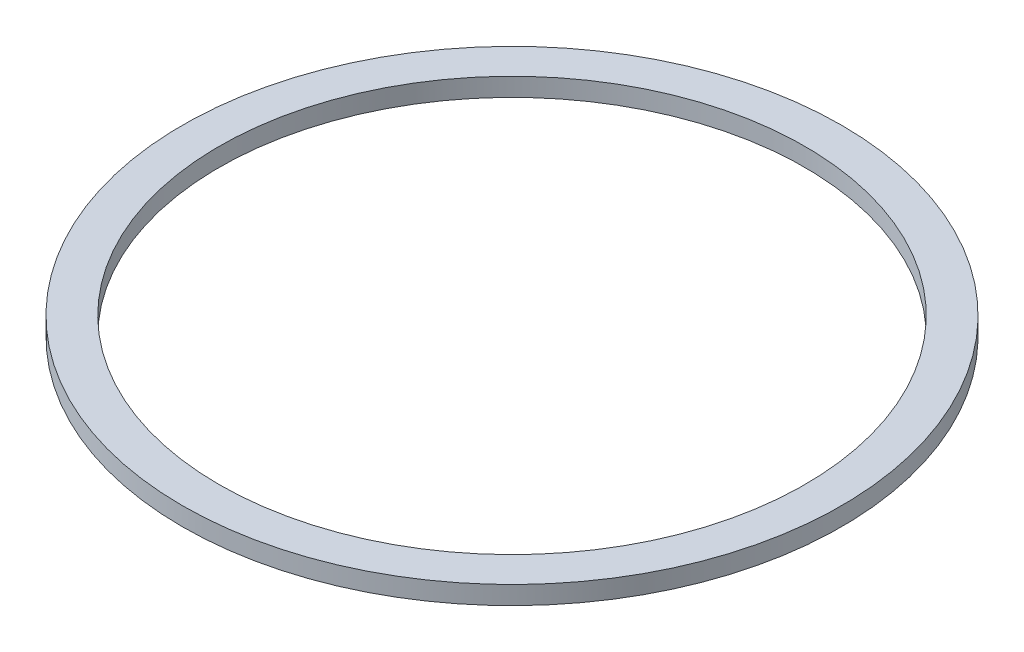
ISO-10303-21;
HEADER;
FILE_DESCRIPTION(('STEP AP214'),'2;1');
FILE_NAME('part.step','',(''),(''),'','','');
FILE_SCHEMA(('AUTOMOTIVE_DESIGN { 1 0 10303 214 1 1 1 1 }'));
ENDSEC;
DATA;
#1=APPLICATION_CONTEXT('core data for automotive mechanical design processes');
#2=APPLICATION_PROTOCOL_DEFINITION('international standard','automotive_design',2000,#1);
#3=PRODUCT_CONTEXT('',#1,'mechanical');
#4=PRODUCT('Part','Part','',(#3));
#5=PRODUCT_RELATED_PRODUCT_CATEGORY('part','',(#4));
#6=PRODUCT_DEFINITION_FORMATION('','',#4);
#7=PRODUCT_DEFINITION_CONTEXT('part definition',#1,'design');
#8=PRODUCT_DEFINITION('design','',#6,#7);
#9=PRODUCT_DEFINITION_SHAPE('','',#8);
#10=(LENGTH_UNIT() NAMED_UNIT(*) SI_UNIT(.MILLI.,.METRE.));
#11=(NAMED_UNIT(*) PLANE_ANGLE_UNIT() SI_UNIT($,.RADIAN.));
#12=(NAMED_UNIT(*) SI_UNIT($,.STERADIAN.) SOLID_ANGLE_UNIT());
#13=UNCERTAINTY_MEASURE_WITH_UNIT(LENGTH_MEASURE(1.E-05),#10,'distance_accuracy_value','');
#14=(GEOMETRIC_REPRESENTATION_CONTEXT(3) GLOBAL_UNCERTAINTY_ASSIGNED_CONTEXT((#13)) GLOBAL_UNIT_ASSIGNED_CONTEXT((#10,
#11,#12)) REPRESENTATION_CONTEXT('',''));
#15=CARTESIAN_POINT('',(0.,0.,0.));
#16=DIRECTION('',(0.,0.,1.));
#17=DIRECTION('',(1.,0.,0.));
#18=AXIS2_PLACEMENT_3D('',#15,#16,#17);
#19=CARTESIAN_POINT('',(0.,1.,0.));
#20=DIRECTION('',(0.,1.,0.));
#21=DIRECTION('',(0.,0.,1.));
#22=AXIS2_PLACEMENT_3D('',#19,#20,#21);
#23=PLANE('',#22);
#24=CARTESIAN_POINT('',(0.,1.,0.));
#25=DIRECTION('',(0.,1.,0.));
#26=DIRECTION('',(0.,0.,1.));
#27=AXIS2_PLACEMENT_3D('',#24,#25,#26);
#28=CIRCLE('',#27,18.);
#29=CARTESIAN_POINT('',(0.,1.,18.));
#30=VERTEX_POINT('',#29);
#31=EDGE_CURVE('E10',#30,#30,#28,.T.);
#32=ORIENTED_EDGE('',*,*,#31,.T.);
#33=EDGE_LOOP('',(#32));
#34=FACE_BOUND('',#33,.T.);
#35=CARTESIAN_POINT('',(0.,1.,0.));
#36=DIRECTION('',(0.,1.,0.));
#37=DIRECTION('',(0.,0.,1.));
#38=AXIS2_PLACEMENT_3D('',#35,#36,#37);
#39=CIRCLE('',#38,16.);
#40=CARTESIAN_POINT('',(0.,1.,16.));
#41=VERTEX_POINT('',#40);
#42=EDGE_CURVE('E62',#41,#41,#39,.T.);
#43=ORIENTED_EDGE('',*,*,#42,.F.);
#44=EDGE_LOOP('',(#43));
#45=FACE_BOUND('',#44,.T.);
#46=ADVANCED_FACE('F47',(#34,#45),#23,.T.);
#47=CARTESIAN_POINT('',(0.,0.,0.));
#48=DIRECTION('',(0.,1.,0.));
#49=DIRECTION('',(0.,0.,1.));
#50=AXIS2_PLACEMENT_3D('',#47,#48,#49);
#51=PLANE('',#50);
#52=CARTESIAN_POINT('',(0.,0.,0.));
#53=DIRECTION('',(0.,1.,0.));
#54=DIRECTION('',(0.,0.,1.));
#55=AXIS2_PLACEMENT_3D('',#52,#53,#54);
#56=CIRCLE('',#55,18.);
#57=CARTESIAN_POINT('',(0.,0.,18.));
#58=VERTEX_POINT('',#57);
#59=EDGE_CURVE('E51',#58,#58,#56,.T.);
#60=ORIENTED_EDGE('',*,*,#59,.F.);
#61=EDGE_LOOP('',(#60));
#62=FACE_BOUND('',#61,.T.);
#63=CARTESIAN_POINT('',(0.,0.,0.));
#64=DIRECTION('',(0.,1.,0.));
#65=DIRECTION('',(0.,0.,1.));
#66=AXIS2_PLACEMENT_3D('',#63,#64,#65);
#67=CIRCLE('',#66,16.);
#68=CARTESIAN_POINT('',(0.,0.,16.));
#69=VERTEX_POINT('',#68);
#70=EDGE_CURVE('E64',#69,#69,#67,.T.);
#71=ORIENTED_EDGE('',*,*,#70,.T.);
#72=EDGE_LOOP('',(#71));
#73=FACE_BOUND('',#72,.T.);
#74=ADVANCED_FACE('F78',(#62,#73),#51,.F.);
#75=CARTESIAN_POINT('',(0.,1.,0.));
#76=DIRECTION('',(0.,-1.,0.));
#77=DIRECTION('',(0.,0.,-1.));
#78=AXIS2_PLACEMENT_3D('',#75,#76,#77);
#79=CYLINDRICAL_SURFACE('',#78,18.);
#80=ORIENTED_EDGE('',*,*,#31,.F.);
#81=EDGE_LOOP('',(#80));
#82=FACE_BOUND('',#81,.T.);
#83=ORIENTED_EDGE('',*,*,#59,.T.);
#84=EDGE_LOOP('',(#83));
#85=FACE_BOUND('',#84,.T.);
#86=ADVANCED_FACE('F49',(#82,#85),#79,.T.);
#87=CARTESIAN_POINT('',(0.,1.,0.));
#88=DIRECTION('',(0.,-1.,0.));
#89=DIRECTION('',(0.,0.,-1.));
#90=AXIS2_PLACEMENT_3D('',#87,#88,#89);
#91=CYLINDRICAL_SURFACE('',#90,16.);
#92=ORIENTED_EDGE('',*,*,#42,.T.);
#93=EDGE_LOOP('',(#92));
#94=FACE_BOUND('',#93,.T.);
#95=ORIENTED_EDGE('',*,*,#70,.F.);
#96=EDGE_LOOP('',(#95));
#97=FACE_BOUND('',#96,.T.);
#98=ADVANCED_FACE('F74',(#94,#97),#91,.F.);
#99=CLOSED_SHELL('',(#46,#74,#86,#98));
#100=MANIFOLD_SOLID_BREP('B2',#99);
#101=ADVANCED_BREP_SHAPE_REPRESENTATION('',(#18,#100),#14);
#102=SHAPE_DEFINITION_REPRESENTATION(#9,#101);
ENDSEC;
END-ISO-10303-21;
